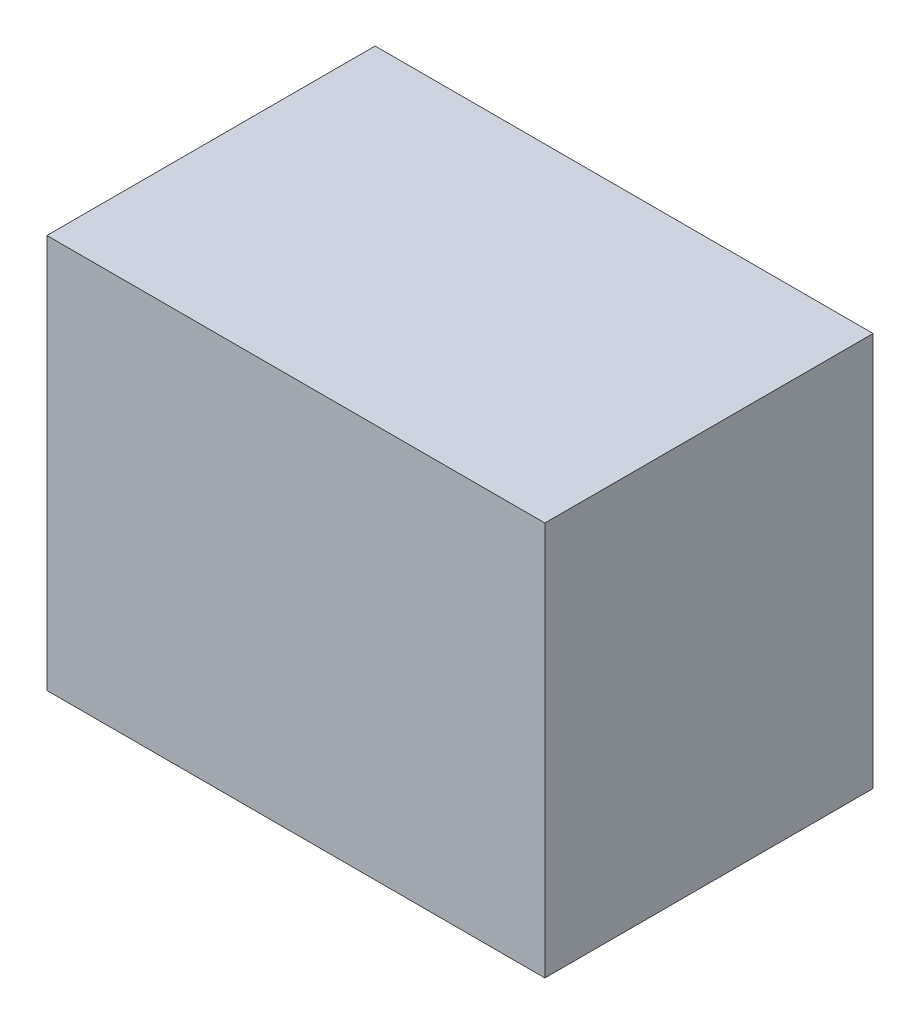
ISO-10303-21;
HEADER;
FILE_DESCRIPTION(('STEP AP214'),'2;1');
FILE_NAME('part.step','',(''),(''),'','','');
FILE_SCHEMA(('AUTOMOTIVE_DESIGN { 1 0 10303 214 1 1 1 1 }'));
ENDSEC;
DATA;
#1=APPLICATION_CONTEXT('core data for automotive mechanical design processes');
#2=APPLICATION_PROTOCOL_DEFINITION('international standard','automotive_design',2000,#1);
#3=PRODUCT_CONTEXT('',#1,'mechanical');
#4=PRODUCT('Part','Part','',(#3));
#5=PRODUCT_RELATED_PRODUCT_CATEGORY('part','',(#4));
#6=PRODUCT_DEFINITION_FORMATION('','',#4);
#7=PRODUCT_DEFINITION_CONTEXT('part definition',#1,'design');
#8=PRODUCT_DEFINITION('design','',#6,#7);
#9=PRODUCT_DEFINITION_SHAPE('','',#8);
#10=(LENGTH_UNIT() NAMED_UNIT(*) SI_UNIT(.MILLI.,.METRE.));
#11=(NAMED_UNIT(*) PLANE_ANGLE_UNIT() SI_UNIT($,.RADIAN.));
#12=(NAMED_UNIT(*) SI_UNIT($,.STERADIAN.) SOLID_ANGLE_UNIT());
#13=UNCERTAINTY_MEASURE_WITH_UNIT(LENGTH_MEASURE(1.E-05),#10,'distance_accuracy_value','');
#14=(GEOMETRIC_REPRESENTATION_CONTEXT(3) GLOBAL_UNCERTAINTY_ASSIGNED_CONTEXT((#13)) GLOBAL_UNIT_ASSIGNED_CONTEXT((#10,
#11,#12)) REPRESENTATION_CONTEXT('',''));
#15=CARTESIAN_POINT('',(0.,0.,0.));
#16=DIRECTION('',(0.,0.,1.));
#17=DIRECTION('',(1.,0.,0.));
#18=AXIS2_PLACEMENT_3D('',#15,#16,#17);
#19=CARTESIAN_POINT('',(0.,38.3,31.9));
#20=DIRECTION('',(1.,0.,0.));
#21=DIRECTION('',(0.,0.,-1.));
#22=AXIS2_PLACEMENT_3D('',#19,#20,#21);
#23=PLANE('',#22);
#24=DIRECTION('',(0.,-1.,0.));
#25=VECTOR('',#24,1.);
#26=CARTESIAN_POINT('',(0.,38.3,0.));
#27=LINE('',#26,#25);
#28=CARTESIAN_POINT('',(0.,38.3,0.));
#29=VERTEX_POINT('',#28);
#30=CARTESIAN_POINT('',(0.,0.,0.));
#31=VERTEX_POINT('',#30);
#32=EDGE_CURVE('E107',#29,#31,#27,.T.);
#33=ORIENTED_EDGE('',*,*,#32,.T.);
#34=DIRECTION('',(0.,0.,-1.));
#35=VECTOR('',#34,1.);
#36=CARTESIAN_POINT('',(0.,0.,31.9));
#37=LINE('',#36,#35);
#38=CARTESIAN_POINT('',(0.,0.,31.9));
#39=VERTEX_POINT('',#38);
#40=EDGE_CURVE('E11',#39,#31,#37,.T.);
#41=ORIENTED_EDGE('',*,*,#40,.F.);
#42=DIRECTION('',(0.,-1.,0.));
#43=VECTOR('',#42,1.);
#44=CARTESIAN_POINT('',(0.,38.3,31.9));
#45=LINE('',#44,#43);
#46=CARTESIAN_POINT('',(0.,38.3,31.9));
#47=VERTEX_POINT('',#46);
#48=EDGE_CURVE('E91',#47,#39,#45,.T.);
#49=ORIENTED_EDGE('',*,*,#48,.F.);
#50=DIRECTION('',(0.,0.,-1.));
#51=VECTOR('',#50,1.);
#52=CARTESIAN_POINT('',(0.,38.3,31.9));
#53=LINE('',#52,#51);
#54=EDGE_CURVE('E103',#47,#29,#53,.T.);
#55=ORIENTED_EDGE('',*,*,#54,.T.);
#56=EDGE_LOOP('',(#33,#41,#49,#55));
#57=FACE_BOUND('',#56,.T.);
#58=ADVANCED_FACE('F39',(#57),#23,.F.);
#59=CARTESIAN_POINT('',(0.,0.,31.9));
#60=DIRECTION('',(0.,1.,0.));
#61=DIRECTION('',(0.,0.,1.));
#62=AXIS2_PLACEMENT_3D('',#59,#60,#61);
#63=PLANE('',#62);
#64=DIRECTION('',(1.,0.,0.));
#65=VECTOR('',#64,1.);
#66=CARTESIAN_POINT('',(0.,0.,0.));
#67=LINE('',#66,#65);
#68=CARTESIAN_POINT('',(48.4,0.,0.));
#69=VERTEX_POINT('',#68);
#70=EDGE_CURVE('E96',#31,#69,#67,.T.);
#71=ORIENTED_EDGE('',*,*,#70,.T.);
#72=DIRECTION('',(0.,0.,-1.));
#73=VECTOR('',#72,1.);
#74=CARTESIAN_POINT('',(48.4,0.,31.9));
#75=LINE('',#74,#73);
#76=CARTESIAN_POINT('',(48.4,0.,31.9));
#77=VERTEX_POINT('',#76);
#78=EDGE_CURVE('E48',#77,#69,#75,.T.);
#79=ORIENTED_EDGE('',*,*,#78,.F.);
#80=DIRECTION('',(1.,0.,0.));
#81=VECTOR('',#80,1.);
#82=CARTESIAN_POINT('',(0.,0.,31.9));
#83=LINE('',#82,#81);
#84=EDGE_CURVE('E86',#39,#77,#83,.T.);
#85=ORIENTED_EDGE('',*,*,#84,.F.);
#86=ORIENTED_EDGE('',*,*,#40,.T.);
#87=EDGE_LOOP('',(#71,#79,#85,#86));
#88=FACE_BOUND('',#87,.T.);
#89=ADVANCED_FACE('F95',(#88),#63,.F.);
#90=CARTESIAN_POINT('',(48.4,0.,31.9));
#91=DIRECTION('',(-1.,0.,0.));
#92=DIRECTION('',(0.,0.,1.));
#93=AXIS2_PLACEMENT_3D('',#90,#91,#92);
#94=PLANE('',#93);
#95=DIRECTION('',(0.,1.,0.));
#96=VECTOR('',#95,1.);
#97=CARTESIAN_POINT('',(48.4,0.,0.));
#98=LINE('',#97,#96);
#99=CARTESIAN_POINT('',(48.4,38.3,0.));
#100=VERTEX_POINT('',#99);
#101=EDGE_CURVE('E73',#69,#100,#98,.T.);
#102=ORIENTED_EDGE('',*,*,#101,.T.);
#103=DIRECTION('',(0.,0.,-1.));
#104=VECTOR('',#103,1.);
#105=CARTESIAN_POINT('',(48.4,38.3,31.9));
#106=LINE('',#105,#104);
#107=CARTESIAN_POINT('',(48.4,38.3,31.9));
#108=VERTEX_POINT('',#107);
#109=EDGE_CURVE('E98',#108,#100,#106,.T.);
#110=ORIENTED_EDGE('',*,*,#109,.F.);
#111=DIRECTION('',(0.,1.,0.));
#112=VECTOR('',#111,1.);
#113=CARTESIAN_POINT('',(48.4,0.,31.9));
#114=LINE('',#113,#112);
#115=EDGE_CURVE('E89',#77,#108,#114,.T.);
#116=ORIENTED_EDGE('',*,*,#115,.F.);
#117=ORIENTED_EDGE('',*,*,#78,.T.);
#118=EDGE_LOOP('',(#102,#110,#116,#117));
#119=FACE_BOUND('',#118,.T.);
#120=ADVANCED_FACE('F99',(#119),#94,.F.);
#121=CARTESIAN_POINT('',(48.4,38.3,31.9));
#122=DIRECTION('',(0.,-1.,0.));
#123=DIRECTION('',(1.,0.,0.));
#124=AXIS2_PLACEMENT_3D('',#121,#122,#123);
#125=PLANE('',#124);
#126=DIRECTION('',(-1.,0.,0.));
#127=VECTOR('',#126,1.);
#128=CARTESIAN_POINT('',(48.4,38.3,0.));
#129=LINE('',#128,#127);
#130=EDGE_CURVE('E79',#100,#29,#129,.T.);
#131=ORIENTED_EDGE('',*,*,#130,.T.);
#132=ORIENTED_EDGE('',*,*,#54,.F.);
#133=DIRECTION('',(-1.,0.,0.));
#134=VECTOR('',#133,1.);
#135=CARTESIAN_POINT('',(48.4,38.3,31.9));
#136=LINE('',#135,#134);
#137=EDGE_CURVE('E56',#108,#47,#136,.T.);
#138=ORIENTED_EDGE('',*,*,#137,.F.);
#139=ORIENTED_EDGE('',*,*,#109,.T.);
#140=EDGE_LOOP('',(#131,#132,#138,#139));
#141=FACE_BOUND('',#140,.T.);
#142=ADVANCED_FACE('F120',(#141),#125,.F.);
#143=CARTESIAN_POINT('',(0.,0.,31.9));
#144=DIRECTION('',(0.,0.,1.));
#145=DIRECTION('',(1.,0.,0.));
#146=AXIS2_PLACEMENT_3D('',#143,#144,#145);
#147=PLANE('',#146);
#148=ORIENTED_EDGE('',*,*,#48,.T.);
#149=ORIENTED_EDGE('',*,*,#84,.T.);
#150=ORIENTED_EDGE('',*,*,#115,.T.);
#151=ORIENTED_EDGE('',*,*,#137,.T.);
#152=EDGE_LOOP('',(#148,#149,#150,#151));
#153=FACE_BOUND('',#152,.T.);
#154=ADVANCED_FACE('F87',(#153),#147,.T.);
#155=CARTESIAN_POINT('',(0.,0.,0.));
#156=DIRECTION('',(0.,0.,1.));
#157=DIRECTION('',(1.,0.,0.));
#158=AXIS2_PLACEMENT_3D('',#155,#156,#157);
#159=PLANE('',#158);
#160=ORIENTED_EDGE('',*,*,#32,.F.);
#161=ORIENTED_EDGE('',*,*,#130,.F.);
#162=ORIENTED_EDGE('',*,*,#101,.F.);
#163=ORIENTED_EDGE('',*,*,#70,.F.);
#164=EDGE_LOOP('',(#160,#161,#162,#163));
#165=FACE_BOUND('',#164,.T.);
#166=ADVANCED_FACE('F123',(#165),#159,.F.);
#167=CLOSED_SHELL('',(#58,#89,#120,#142,#154,#166));
#168=MANIFOLD_SOLID_BREP('B2',#167);
#169=ADVANCED_BREP_SHAPE_REPRESENTATION('',(#18,#168),#14);
#170=SHAPE_DEFINITION_REPRESENTATION(#9,#169);
ENDSEC;
END-ISO-10303-21;
